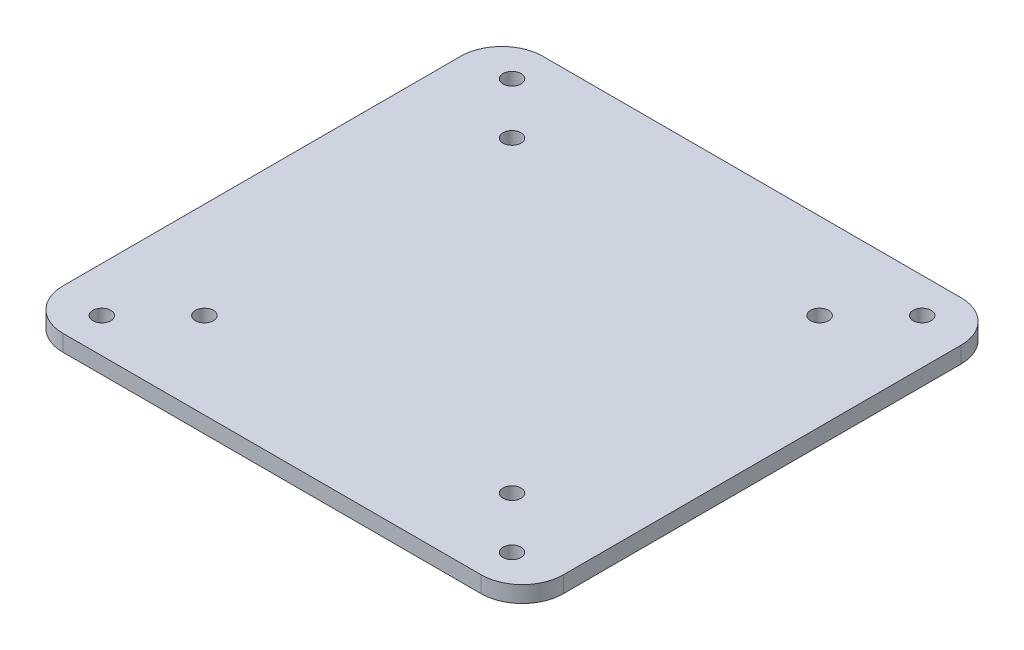
ISO-10303-21;
HEADER;
FILE_DESCRIPTION(('STEP AP214'),'2;1');
FILE_NAME('part.step','',(''),(''),'','','');
FILE_SCHEMA(('AUTOMOTIVE_DESIGN { 1 0 10303 214 1 1 1 1 }'));
ENDSEC;
DATA;
#1=APPLICATION_CONTEXT('core data for automotive mechanical design processes');
#2=APPLICATION_PROTOCOL_DEFINITION('international standard','automotive_design',2000,#1);
#3=PRODUCT_CONTEXT('',#1,'mechanical');
#4=PRODUCT('Part','Part','',(#3));
#5=PRODUCT_RELATED_PRODUCT_CATEGORY('part','',(#4));
#6=PRODUCT_DEFINITION_FORMATION('','',#4);
#7=PRODUCT_DEFINITION_CONTEXT('part definition',#1,'design');
#8=PRODUCT_DEFINITION('design','',#6,#7);
#9=PRODUCT_DEFINITION_SHAPE('','',#8);
#10=(LENGTH_UNIT() NAMED_UNIT(*) SI_UNIT(.MILLI.,.METRE.));
#11=(NAMED_UNIT(*) PLANE_ANGLE_UNIT() SI_UNIT($,.RADIAN.));
#12=(NAMED_UNIT(*) SI_UNIT($,.STERADIAN.) SOLID_ANGLE_UNIT());
#13=UNCERTAINTY_MEASURE_WITH_UNIT(LENGTH_MEASURE(1.E-05),#10,'distance_accuracy_value','');
#14=(GEOMETRIC_REPRESENTATION_CONTEXT(3) GLOBAL_UNCERTAINTY_ASSIGNED_CONTEXT((#13)) GLOBAL_UNIT_ASSIGNED_CONTEXT((#10,
#11,#12)) REPRESENTATION_CONTEXT('',''));
#15=CARTESIAN_POINT('',(0.,0.,0.));
#16=DIRECTION('',(0.,0.,1.));
#17=DIRECTION('',(1.,0.,0.));
#18=AXIS2_PLACEMENT_3D('',#15,#16,#17);
#19=CARTESIAN_POINT('',(0.,4.,0.));
#20=DIRECTION('',(0.,1.,0.));
#21=DIRECTION('',(0.,0.,1.));
#22=AXIS2_PLACEMENT_3D('',#19,#20,#21);
#23=PLANE('',#22);
#24=CARTESIAN_POINT('',(23.5,4.,-21.));
#25=DIRECTION('',(0.,1.,0.));
#26=DIRECTION('',(0.,0.,1.));
#27=AXIS2_PLACEMENT_3D('',#24,#25,#26);
#28=CIRCLE('',#27,2.2);
#29=CARTESIAN_POINT('',(23.5,4.,-18.8));
#30=VERTEX_POINT('',#29);
#31=EDGE_CURVE('E255',#30,#30,#28,.T.);
#32=ORIENTED_EDGE('',*,*,#31,.F.);
#33=EDGE_LOOP('',(#32));
#34=FACE_BOUND('',#33,.T.);
#35=CARTESIAN_POINT('',(98.5,4.,-96.));
#36=DIRECTION('',(0.,1.,0.));
#37=DIRECTION('',(0.,0.,1.));
#38=AXIS2_PLACEMENT_3D('',#35,#36,#37);
#39=CIRCLE('',#38,2.2);
#40=CARTESIAN_POINT('',(98.5,4.,-93.8));
#41=VERTEX_POINT('',#40);
#42=EDGE_CURVE('E239',#41,#41,#39,.T.);
#43=ORIENTED_EDGE('',*,*,#42,.F.);
#44=EDGE_LOOP('',(#43));
#45=FACE_BOUND('',#44,.T.);
#46=CARTESIAN_POINT('',(11.,4.,-8.49999999999999));
#47=DIRECTION('',(0.,1.,0.));
#48=DIRECTION('',(0.,0.,1.));
#49=AXIS2_PLACEMENT_3D('',#46,#47,#48);
#50=CIRCLE('',#49,2.2);
#51=CARTESIAN_POINT('',(11.,4.,-6.3));
#52=VERTEX_POINT('',#51);
#53=EDGE_CURVE('E223',#52,#52,#50,.T.);
#54=ORIENTED_EDGE('',*,*,#53,.F.);
#55=EDGE_LOOP('',(#54));
#56=FACE_BOUND('',#55,.T.);
#57=CARTESIAN_POINT('',(111.,4.,-108.5));
#58=DIRECTION('',(0.,1.,0.));
#59=DIRECTION('',(0.,0.,1.));
#60=AXIS2_PLACEMENT_3D('',#57,#58,#59);
#61=CIRCLE('',#60,2.2);
#62=CARTESIAN_POINT('',(111.,4.,-106.3));
#63=VERTEX_POINT('',#62);
#64=EDGE_CURVE('E141',#63,#63,#61,.T.);
#65=ORIENTED_EDGE('',*,*,#64,.F.);
#66=EDGE_LOOP('',(#65));
#67=FACE_BOUND('',#66,.T.);
#68=DIRECTION('',(-1.,0.,0.));
#69=VECTOR('',#68,1.);
#70=CARTESIAN_POINT('',(0.,4.,-117.));
#71=LINE('',#70,#69);
#72=CARTESIAN_POINT('',(112.,4.,-117.));
#73=VERTEX_POINT('',#72);
#74=CARTESIAN_POINT('',(10.,4.,-117.));
#75=VERTEX_POINT('',#74);
#76=EDGE_CURVE('E152',#73,#75,#71,.T.);
#77=ORIENTED_EDGE('',*,*,#76,.T.);
#78=CARTESIAN_POINT('',(10.,4.,-107.));
#79=DIRECTION('',(0.,1.,0.));
#80=DIRECTION('',(0.,0.,1.));
#81=AXIS2_PLACEMENT_3D('',#78,#79,#80);
#82=CIRCLE('',#81,10.);
#83=CARTESIAN_POINT('',(0.,4.,-107.));
#84=VERTEX_POINT('',#83);
#85=EDGE_CURVE('E182',#75,#84,#82,.T.);
#86=ORIENTED_EDGE('',*,*,#85,.T.);
#87=DIRECTION('',(0.,0.,1.));
#88=VECTOR('',#87,1.);
#89=CARTESIAN_POINT('',(0.,4.,-117.));
#90=LINE('',#89,#88);
#91=CARTESIAN_POINT('',(0.,4.,-10.));
#92=VERTEX_POINT('',#91);
#93=EDGE_CURVE('E131',#84,#92,#90,.T.);
#94=ORIENTED_EDGE('',*,*,#93,.T.);
#95=CARTESIAN_POINT('',(10.,4.,-10.));
#96=DIRECTION('',(0.,1.,0.));
#97=DIRECTION('',(0.,0.,1.));
#98=AXIS2_PLACEMENT_3D('',#95,#96,#97);
#99=CIRCLE('',#98,10.);
#100=CARTESIAN_POINT('',(10.,4.,0.));
#101=VERTEX_POINT('',#100);
#102=EDGE_CURVE('E174',#92,#101,#99,.T.);
#103=ORIENTED_EDGE('',*,*,#102,.T.);
#104=DIRECTION('',(1.,0.,0.));
#105=VECTOR('',#104,1.);
#106=CARTESIAN_POINT('',(0.,4.,0.));
#107=LINE('',#106,#105);
#108=CARTESIAN_POINT('',(112.,4.,0.));
#109=VERTEX_POINT('',#108);
#110=EDGE_CURVE('E197',#101,#109,#107,.T.);
#111=ORIENTED_EDGE('',*,*,#110,.T.);
#112=CARTESIAN_POINT('',(112.,4.,-9.99999999999999));
#113=DIRECTION('',(0.,1.,0.));
#114=DIRECTION('',(0.,0.,1.));
#115=AXIS2_PLACEMENT_3D('',#112,#113,#114);
#116=CIRCLE('',#115,10.);
#117=CARTESIAN_POINT('',(122.,4.,-10.));
#118=VERTEX_POINT('',#117);
#119=EDGE_CURVE('E66',#109,#118,#116,.T.);
#120=ORIENTED_EDGE('',*,*,#119,.T.);
#121=DIRECTION('',(0.,0.,-1.));
#122=VECTOR('',#121,1.);
#123=CARTESIAN_POINT('',(122.,4.,-117.));
#124=LINE('',#123,#122);
#125=CARTESIAN_POINT('',(122.,4.,-107.));
#126=VERTEX_POINT('',#125);
#127=EDGE_CURVE('E205',#118,#126,#124,.T.);
#128=ORIENTED_EDGE('',*,*,#127,.T.);
#129=CARTESIAN_POINT('',(112.,4.,-107.));
#130=DIRECTION('',(0.,1.,0.));
#131=DIRECTION('',(0.,0.,1.));
#132=AXIS2_PLACEMENT_3D('',#129,#130,#131);
#133=CIRCLE('',#132,10.);
#134=EDGE_CURVE('E179',#126,#73,#133,.T.);
#135=ORIENTED_EDGE('',*,*,#134,.T.);
#136=EDGE_LOOP('',(#77,#86,#94,#103,#111,#120,#128,#135));
#137=FACE_BOUND('',#136,.T.);
#138=CARTESIAN_POINT('',(11.,4.,-108.5));
#139=DIRECTION('',(0.,1.,0.));
#140=DIRECTION('',(0.,0.,1.));
#141=AXIS2_PLACEMENT_3D('',#138,#139,#140);
#142=CIRCLE('',#141,2.2);
#143=CARTESIAN_POINT('',(11.,4.,-106.3));
#144=VERTEX_POINT('',#143);
#145=EDGE_CURVE('E217',#144,#144,#142,.T.);
#146=ORIENTED_EDGE('',*,*,#145,.F.);
#147=EDGE_LOOP('',(#146));
#148=FACE_BOUND('',#147,.T.);
#149=CARTESIAN_POINT('',(111.,4.,-8.50000000000001));
#150=DIRECTION('',(0.,1.,0.));
#151=DIRECTION('',(0.,0.,1.));
#152=AXIS2_PLACEMENT_3D('',#149,#150,#151);
#153=CIRCLE('',#152,2.2);
#154=CARTESIAN_POINT('',(111.,4.,-6.30000000000001));
#155=VERTEX_POINT('',#154);
#156=EDGE_CURVE('E231',#155,#155,#153,.T.);
#157=ORIENTED_EDGE('',*,*,#156,.F.);
#158=EDGE_LOOP('',(#157));
#159=FACE_BOUND('',#158,.T.);
#160=CARTESIAN_POINT('',(23.5,4.,-96.));
#161=DIRECTION('',(0.,1.,0.));
#162=DIRECTION('',(0.,0.,1.));
#163=AXIS2_PLACEMENT_3D('',#160,#161,#162);
#164=CIRCLE('',#163,2.2);
#165=CARTESIAN_POINT('',(23.5,4.,-93.8));
#166=VERTEX_POINT('',#165);
#167=EDGE_CURVE('E247',#166,#166,#164,.T.);
#168=ORIENTED_EDGE('',*,*,#167,.F.);
#169=EDGE_LOOP('',(#168));
#170=FACE_BOUND('',#169,.T.);
#171=CARTESIAN_POINT('',(98.5,4.,-21.));
#172=DIRECTION('',(0.,1.,0.));
#173=DIRECTION('',(0.,0.,1.));
#174=AXIS2_PLACEMENT_3D('',#171,#172,#173);
#175=CIRCLE('',#174,2.2);
#176=CARTESIAN_POINT('',(98.5,4.,-18.8));
#177=VERTEX_POINT('',#176);
#178=EDGE_CURVE('E263',#177,#177,#175,.T.);
#179=ORIENTED_EDGE('',*,*,#178,.F.);
#180=EDGE_LOOP('',(#179));
#181=FACE_BOUND('',#180,.T.);
#182=ADVANCED_FACE('F43',(#34,#45,#56,#67,#137,#148,#159,#170,#181),#23,.T.);
#183=CARTESIAN_POINT('',(0.,0.,0.));
#184=DIRECTION('',(0.,1.,0.));
#185=DIRECTION('',(0.,0.,1.));
#186=AXIS2_PLACEMENT_3D('',#183,#184,#185);
#187=PLANE('',#186);
#188=DIRECTION('',(0.,0.,1.));
#189=VECTOR('',#188,1.);
#190=CARTESIAN_POINT('',(0.,0.,-117.));
#191=LINE('',#190,#189);
#192=CARTESIAN_POINT('',(0.,0.,-107.));
#193=VERTEX_POINT('',#192);
#194=CARTESIAN_POINT('',(0.,0.,-10.));
#195=VERTEX_POINT('',#194);
#196=EDGE_CURVE('E128',#193,#195,#191,.T.);
#197=ORIENTED_EDGE('',*,*,#196,.F.);
#198=CARTESIAN_POINT('',(10.,0.,-107.));
#199=DIRECTION('',(0.,1.,0.));
#200=DIRECTION('',(0.,0.,1.));
#201=AXIS2_PLACEMENT_3D('',#198,#199,#200);
#202=CIRCLE('',#201,10.);
#203=CARTESIAN_POINT('',(10.,0.,-117.));
#204=VERTEX_POINT('',#203);
#205=EDGE_CURVE('E110',#193,#204,#202,.F.);
#206=ORIENTED_EDGE('',*,*,#205,.T.);
#207=DIRECTION('',(-1.,0.,0.));
#208=VECTOR('',#207,1.);
#209=CARTESIAN_POINT('',(0.,0.,-117.));
#210=LINE('',#209,#208);
#211=CARTESIAN_POINT('',(112.,0.,-117.));
#212=VERTEX_POINT('',#211);
#213=EDGE_CURVE('E157',#212,#204,#210,.T.);
#214=ORIENTED_EDGE('',*,*,#213,.F.);
#215=CARTESIAN_POINT('',(112.,0.,-107.));
#216=DIRECTION('',(0.,1.,0.));
#217=DIRECTION('',(0.,0.,1.));
#218=AXIS2_PLACEMENT_3D('',#215,#216,#217);
#219=CIRCLE('',#218,10.);
#220=CARTESIAN_POINT('',(122.,0.,-107.));
#221=VERTEX_POINT('',#220);
#222=EDGE_CURVE('E122',#212,#221,#219,.F.);
#223=ORIENTED_EDGE('',*,*,#222,.T.);
#224=DIRECTION('',(0.,0.,-1.));
#225=VECTOR('',#224,1.);
#226=CARTESIAN_POINT('',(122.,0.,-117.));
#227=LINE('',#226,#225);
#228=CARTESIAN_POINT('',(122.,0.,-10.));
#229=VERTEX_POINT('',#228);
#230=EDGE_CURVE('E146',#229,#221,#227,.T.);
#231=ORIENTED_EDGE('',*,*,#230,.F.);
#232=CARTESIAN_POINT('',(112.,0.,-9.99999999999999));
#233=DIRECTION('',(0.,1.,0.));
#234=DIRECTION('',(0.,0.,1.));
#235=AXIS2_PLACEMENT_3D('',#232,#233,#234);
#236=CIRCLE('',#235,10.);
#237=CARTESIAN_POINT('',(112.,0.,0.));
#238=VERTEX_POINT('',#237);
#239=EDGE_CURVE('E164',#229,#238,#236,.F.);
#240=ORIENTED_EDGE('',*,*,#239,.T.);
#241=DIRECTION('',(1.,0.,0.));
#242=VECTOR('',#241,1.);
#243=CARTESIAN_POINT('',(0.,0.,0.));
#244=LINE('',#243,#242);
#245=CARTESIAN_POINT('',(10.,0.,0.));
#246=VERTEX_POINT('',#245);
#247=EDGE_CURVE('E140',#246,#238,#244,.T.);
#248=ORIENTED_EDGE('',*,*,#247,.F.);
#249=CARTESIAN_POINT('',(10.,0.,-10.));
#250=DIRECTION('',(0.,1.,0.));
#251=DIRECTION('',(0.,0.,1.));
#252=AXIS2_PLACEMENT_3D('',#249,#250,#251);
#253=CIRCLE('',#252,10.);
#254=EDGE_CURVE('E133',#246,#195,#253,.F.);
#255=ORIENTED_EDGE('',*,*,#254,.T.);
#256=EDGE_LOOP('',(#197,#206,#214,#223,#231,#240,#248,#255));
#257=FACE_BOUND('',#256,.T.);
#258=CARTESIAN_POINT('',(111.,0.,-108.5));
#259=DIRECTION('',(0.,1.,0.));
#260=DIRECTION('',(0.,0.,1.));
#261=AXIS2_PLACEMENT_3D('',#258,#259,#260);
#262=CIRCLE('',#261,2.2);
#263=CARTESIAN_POINT('',(111.,0.,-106.3));
#264=VERTEX_POINT('',#263);
#265=EDGE_CURVE('E149',#264,#264,#262,.T.);
#266=ORIENTED_EDGE('',*,*,#265,.T.);
#267=EDGE_LOOP('',(#266));
#268=FACE_BOUND('',#267,.T.);
#269=CARTESIAN_POINT('',(11.,0.,-108.5));
#270=DIRECTION('',(0.,1.,0.));
#271=DIRECTION('',(0.,0.,1.));
#272=AXIS2_PLACEMENT_3D('',#269,#270,#271);
#273=CIRCLE('',#272,2.2);
#274=CARTESIAN_POINT('',(11.,0.,-106.3));
#275=VERTEX_POINT('',#274);
#276=EDGE_CURVE('E219',#275,#275,#273,.T.);
#277=ORIENTED_EDGE('',*,*,#276,.T.);
#278=EDGE_LOOP('',(#277));
#279=FACE_BOUND('',#278,.T.);
#280=CARTESIAN_POINT('',(11.,0.,-8.49999999999999));
#281=DIRECTION('',(0.,1.,0.));
#282=DIRECTION('',(0.,0.,1.));
#283=AXIS2_PLACEMENT_3D('',#280,#281,#282);
#284=CIRCLE('',#283,2.2);
#285=CARTESIAN_POINT('',(11.,0.,-6.3));
#286=VERTEX_POINT('',#285);
#287=EDGE_CURVE('E227',#286,#286,#284,.T.);
#288=ORIENTED_EDGE('',*,*,#287,.T.);
#289=EDGE_LOOP('',(#288));
#290=FACE_BOUND('',#289,.T.);
#291=CARTESIAN_POINT('',(111.,0.,-8.50000000000001));
#292=DIRECTION('',(0.,1.,0.));
#293=DIRECTION('',(0.,0.,1.));
#294=AXIS2_PLACEMENT_3D('',#291,#292,#293);
#295=CIRCLE('',#294,2.2);
#296=CARTESIAN_POINT('',(111.,0.,-6.30000000000001));
#297=VERTEX_POINT('',#296);
#298=EDGE_CURVE('E235',#297,#297,#295,.T.);
#299=ORIENTED_EDGE('',*,*,#298,.T.);
#300=EDGE_LOOP('',(#299));
#301=FACE_BOUND('',#300,.T.);
#302=CARTESIAN_POINT('',(98.5,0.,-96.));
#303=DIRECTION('',(0.,1.,0.));
#304=DIRECTION('',(0.,0.,1.));
#305=AXIS2_PLACEMENT_3D('',#302,#303,#304);
#306=CIRCLE('',#305,2.2);
#307=CARTESIAN_POINT('',(98.5,0.,-93.8));
#308=VERTEX_POINT('',#307);
#309=EDGE_CURVE('E243',#308,#308,#306,.T.);
#310=ORIENTED_EDGE('',*,*,#309,.T.);
#311=EDGE_LOOP('',(#310));
#312=FACE_BOUND('',#311,.T.);
#313=CARTESIAN_POINT('',(23.5,0.,-96.));
#314=DIRECTION('',(0.,1.,0.));
#315=DIRECTION('',(0.,0.,1.));
#316=AXIS2_PLACEMENT_3D('',#313,#314,#315);
#317=CIRCLE('',#316,2.2);
#318=CARTESIAN_POINT('',(23.5,0.,-93.8));
#319=VERTEX_POINT('',#318);
#320=EDGE_CURVE('E251',#319,#319,#317,.T.);
#321=ORIENTED_EDGE('',*,*,#320,.T.);
#322=EDGE_LOOP('',(#321));
#323=FACE_BOUND('',#322,.T.);
#324=CARTESIAN_POINT('',(23.5,0.,-21.));
#325=DIRECTION('',(0.,1.,0.));
#326=DIRECTION('',(0.,0.,1.));
#327=AXIS2_PLACEMENT_3D('',#324,#325,#326);
#328=CIRCLE('',#327,2.2);
#329=CARTESIAN_POINT('',(23.5,0.,-18.8));
#330=VERTEX_POINT('',#329);
#331=EDGE_CURVE('E259',#330,#330,#328,.T.);
#332=ORIENTED_EDGE('',*,*,#331,.T.);
#333=EDGE_LOOP('',(#332));
#334=FACE_BOUND('',#333,.T.);
#335=CARTESIAN_POINT('',(98.5,0.,-21.));
#336=DIRECTION('',(0.,1.,0.));
#337=DIRECTION('',(0.,0.,1.));
#338=AXIS2_PLACEMENT_3D('',#335,#336,#337);
#339=CIRCLE('',#338,2.2);
#340=CARTESIAN_POINT('',(98.5,0.,-18.8));
#341=VERTEX_POINT('',#340);
#342=EDGE_CURVE('E267',#341,#341,#339,.T.);
#343=ORIENTED_EDGE('',*,*,#342,.T.);
#344=EDGE_LOOP('',(#343));
#345=FACE_BOUND('',#344,.T.);
#346=ADVANCED_FACE('F136',(#257,#268,#279,#290,#301,#312,#323,#334,#345),#187,.F.);
#347=CARTESIAN_POINT('',(0.,4.,-117.));
#348=DIRECTION('',(1.,0.,0.));
#349=DIRECTION('',(0.,0.,-1.));
#350=AXIS2_PLACEMENT_3D('',#347,#348,#349);
#351=PLANE('',#350);
#352=ORIENTED_EDGE('',*,*,#93,.F.);
#353=DIRECTION('',(0.,-1.,0.));
#354=VECTOR('',#353,1.);
#355=CARTESIAN_POINT('',(0.,4.,-107.));
#356=LINE('',#355,#354);
#357=EDGE_CURVE('E114',#84,#193,#356,.T.);
#358=ORIENTED_EDGE('',*,*,#357,.T.);
#359=ORIENTED_EDGE('',*,*,#196,.T.);
#360=DIRECTION('',(0.,-1.,0.));
#361=VECTOR('',#360,1.);
#362=CARTESIAN_POINT('',(0.,4.,-9.99999999999999));
#363=LINE('',#362,#361);
#364=EDGE_CURVE('E134',#195,#92,#363,.F.);
#365=ORIENTED_EDGE('',*,*,#364,.T.);
#366=EDGE_LOOP('',(#352,#358,#359,#365));
#367=FACE_BOUND('',#366,.T.);
#368=ADVANCED_FACE('F127',(#367),#351,.F.);
#369=CARTESIAN_POINT('',(0.,4.,0.));
#370=DIRECTION('',(0.,0.,-1.));
#371=DIRECTION('',(-1.,0.,0.));
#372=AXIS2_PLACEMENT_3D('',#369,#370,#371);
#373=PLANE('',#372);
#374=ORIENTED_EDGE('',*,*,#247,.T.);
#375=DIRECTION('',(0.,-1.,0.));
#376=VECTOR('',#375,1.);
#377=CARTESIAN_POINT('',(112.,4.,0.));
#378=LINE('',#377,#376);
#379=EDGE_CURVE('E11',#238,#109,#378,.F.);
#380=ORIENTED_EDGE('',*,*,#379,.T.);
#381=ORIENTED_EDGE('',*,*,#110,.F.);
#382=DIRECTION('',(0.,-1.,0.));
#383=VECTOR('',#382,1.);
#384=CARTESIAN_POINT('',(10.,4.,0.));
#385=LINE('',#384,#383);
#386=EDGE_CURVE('E52',#101,#246,#385,.T.);
#387=ORIENTED_EDGE('',*,*,#386,.T.);
#388=EDGE_LOOP('',(#374,#380,#381,#387));
#389=FACE_BOUND('',#388,.T.);
#390=ADVANCED_FACE('F195',(#389),#373,.F.);
#391=CARTESIAN_POINT('',(122.,4.,-117.));
#392=DIRECTION('',(-1.,0.,0.));
#393=DIRECTION('',(0.,0.,1.));
#394=AXIS2_PLACEMENT_3D('',#391,#392,#393);
#395=PLANE('',#394);
#396=ORIENTED_EDGE('',*,*,#230,.T.);
#397=DIRECTION('',(0.,-1.,0.));
#398=VECTOR('',#397,1.);
#399=CARTESIAN_POINT('',(122.,4.,-107.));
#400=LINE('',#399,#398);
#401=EDGE_CURVE('E59',#221,#126,#400,.F.);
#402=ORIENTED_EDGE('',*,*,#401,.T.);
#403=ORIENTED_EDGE('',*,*,#127,.F.);
#404=DIRECTION('',(0.,-1.,0.));
#405=VECTOR('',#404,1.);
#406=CARTESIAN_POINT('',(122.,4.,-9.99999999999999));
#407=LINE('',#406,#405);
#408=EDGE_CURVE('E185',#118,#229,#407,.T.);
#409=ORIENTED_EDGE('',*,*,#408,.T.);
#410=EDGE_LOOP('',(#396,#402,#403,#409));
#411=FACE_BOUND('',#410,.T.);
#412=ADVANCED_FACE('F204',(#411),#395,.F.);
#413=CARTESIAN_POINT('',(0.,4.,-117.));
#414=DIRECTION('',(0.,0.,1.));
#415=DIRECTION('',(1.,0.,0.));
#416=AXIS2_PLACEMENT_3D('',#413,#414,#415);
#417=PLANE('',#416);
#418=ORIENTED_EDGE('',*,*,#213,.T.);
#419=DIRECTION('',(0.,-1.,0.));
#420=VECTOR('',#419,1.);
#421=CARTESIAN_POINT('',(10.,4.,-117.));
#422=LINE('',#421,#420);
#423=EDGE_CURVE('E115',#204,#75,#422,.F.);
#424=ORIENTED_EDGE('',*,*,#423,.T.);
#425=ORIENTED_EDGE('',*,*,#76,.F.);
#426=DIRECTION('',(0.,-1.,0.));
#427=VECTOR('',#426,1.);
#428=CARTESIAN_POINT('',(112.,4.,-117.));
#429=LINE('',#428,#427);
#430=EDGE_CURVE('E121',#73,#212,#429,.T.);
#431=ORIENTED_EDGE('',*,*,#430,.T.);
#432=EDGE_LOOP('',(#418,#424,#425,#431));
#433=FACE_BOUND('',#432,.T.);
#434=ADVANCED_FACE('F291',(#433),#417,.F.);
#435=CARTESIAN_POINT('',(111.,4.,-108.5));
#436=DIRECTION('',(0.,-1.,0.));
#437=DIRECTION('',(0.,0.,-1.));
#438=AXIS2_PLACEMENT_3D('',#435,#436,#437);
#439=CYLINDRICAL_SURFACE('',#438,2.2);
#440=ORIENTED_EDGE('',*,*,#64,.T.);
#441=EDGE_LOOP('',(#440));
#442=FACE_BOUND('',#441,.T.);
#443=ORIENTED_EDGE('',*,*,#265,.F.);
#444=EDGE_LOOP('',(#443));
#445=FACE_BOUND('',#444,.T.);
#446=ADVANCED_FACE('F288',(#442,#445),#439,.F.);
#447=CARTESIAN_POINT('',(11.,4.,-108.5));
#448=DIRECTION('',(0.,-1.,0.));
#449=DIRECTION('',(0.,0.,-1.));
#450=AXIS2_PLACEMENT_3D('',#447,#448,#449);
#451=CYLINDRICAL_SURFACE('',#450,2.2);
#452=ORIENTED_EDGE('',*,*,#145,.T.);
#453=EDGE_LOOP('',(#452));
#454=FACE_BOUND('',#453,.T.);
#455=ORIENTED_EDGE('',*,*,#276,.F.);
#456=EDGE_LOOP('',(#455));
#457=FACE_BOUND('',#456,.T.);
#458=ADVANCED_FACE('F350',(#454,#457),#451,.F.);
#459=CARTESIAN_POINT('',(11.,4.,-8.49999999999999));
#460=DIRECTION('',(0.,-1.,0.));
#461=DIRECTION('',(0.,0.,-1.));
#462=AXIS2_PLACEMENT_3D('',#459,#460,#461);
#463=CYLINDRICAL_SURFACE('',#462,2.2);
#464=ORIENTED_EDGE('',*,*,#53,.T.);
#465=EDGE_LOOP('',(#464));
#466=FACE_BOUND('',#465,.T.);
#467=ORIENTED_EDGE('',*,*,#287,.F.);
#468=EDGE_LOOP('',(#467));
#469=FACE_BOUND('',#468,.T.);
#470=ADVANCED_FACE('F347',(#466,#469),#463,.F.);
#471=CARTESIAN_POINT('',(111.,4.,-8.50000000000001));
#472=DIRECTION('',(0.,-1.,0.));
#473=DIRECTION('',(0.,0.,-1.));
#474=AXIS2_PLACEMENT_3D('',#471,#472,#473);
#475=CYLINDRICAL_SURFACE('',#474,2.2);
#476=ORIENTED_EDGE('',*,*,#156,.T.);
#477=EDGE_LOOP('',(#476));
#478=FACE_BOUND('',#477,.T.);
#479=ORIENTED_EDGE('',*,*,#298,.F.);
#480=EDGE_LOOP('',(#479));
#481=FACE_BOUND('',#480,.T.);
#482=ADVANCED_FACE('F343',(#478,#481),#475,.F.);
#483=CARTESIAN_POINT('',(98.5,4.,-96.));
#484=DIRECTION('',(0.,-1.,0.));
#485=DIRECTION('',(0.,0.,-1.));
#486=AXIS2_PLACEMENT_3D('',#483,#484,#485);
#487=CYLINDRICAL_SURFACE('',#486,2.2);
#488=ORIENTED_EDGE('',*,*,#42,.T.);
#489=EDGE_LOOP('',(#488));
#490=FACE_BOUND('',#489,.T.);
#491=ORIENTED_EDGE('',*,*,#309,.F.);
#492=EDGE_LOOP('',(#491));
#493=FACE_BOUND('',#492,.T.);
#494=ADVANCED_FACE('F325',(#490,#493),#487,.F.);
#495=CARTESIAN_POINT('',(23.5,4.,-96.));
#496=DIRECTION('',(0.,-1.,0.));
#497=DIRECTION('',(0.,0.,-1.));
#498=AXIS2_PLACEMENT_3D('',#495,#496,#497);
#499=CYLINDRICAL_SURFACE('',#498,2.2);
#500=ORIENTED_EDGE('',*,*,#167,.T.);
#501=EDGE_LOOP('',(#500));
#502=FACE_BOUND('',#501,.T.);
#503=ORIENTED_EDGE('',*,*,#320,.F.);
#504=EDGE_LOOP('',(#503));
#505=FACE_BOUND('',#504,.T.);
#506=ADVANCED_FACE('F321',(#502,#505),#499,.F.);
#507=CARTESIAN_POINT('',(23.5,4.,-21.));
#508=DIRECTION('',(0.,-1.,0.));
#509=DIRECTION('',(0.,0.,-1.));
#510=AXIS2_PLACEMENT_3D('',#507,#508,#509);
#511=CYLINDRICAL_SURFACE('',#510,2.2);
#512=ORIENTED_EDGE('',*,*,#31,.T.);
#513=EDGE_LOOP('',(#512));
#514=FACE_BOUND('',#513,.T.);
#515=ORIENTED_EDGE('',*,*,#331,.F.);
#516=EDGE_LOOP('',(#515));
#517=FACE_BOUND('',#516,.T.);
#518=ADVANCED_FACE('F324',(#514,#517),#511,.F.);
#519=CARTESIAN_POINT('',(98.5,4.,-21.));
#520=DIRECTION('',(0.,-1.,0.));
#521=DIRECTION('',(0.,0.,-1.));
#522=AXIS2_PLACEMENT_3D('',#519,#520,#521);
#523=CYLINDRICAL_SURFACE('',#522,2.2);
#524=ORIENTED_EDGE('',*,*,#178,.T.);
#525=EDGE_LOOP('',(#524));
#526=FACE_BOUND('',#525,.T.);
#527=ORIENTED_EDGE('',*,*,#342,.F.);
#528=EDGE_LOOP('',(#527));
#529=FACE_BOUND('',#528,.T.);
#530=ADVANCED_FACE('F275',(#526,#529),#523,.F.);
#531=CARTESIAN_POINT('',(10.,4.,-107.));
#532=DIRECTION('',(0.,-1.,0.));
#533=DIRECTION('',(0.,0.,-1.));
#534=AXIS2_PLACEMENT_3D('',#531,#532,#533);
#535=CYLINDRICAL_SURFACE('',#534,10.);
#536=ORIENTED_EDGE('',*,*,#85,.F.);
#537=ORIENTED_EDGE('',*,*,#423,.F.);
#538=ORIENTED_EDGE('',*,*,#205,.F.);
#539=ORIENTED_EDGE('',*,*,#357,.F.);
#540=EDGE_LOOP('',(#536,#537,#538,#539));
#541=FACE_BOUND('',#540,.T.);
#542=ADVANCED_FACE('F113',(#541),#535,.T.);
#543=CARTESIAN_POINT('',(112.,4.,-107.));
#544=DIRECTION('',(0.,-1.,0.));
#545=DIRECTION('',(0.,0.,-1.));
#546=AXIS2_PLACEMENT_3D('',#543,#544,#545);
#547=CYLINDRICAL_SURFACE('',#546,10.);
#548=ORIENTED_EDGE('',*,*,#134,.F.);
#549=ORIENTED_EDGE('',*,*,#401,.F.);
#550=ORIENTED_EDGE('',*,*,#222,.F.);
#551=ORIENTED_EDGE('',*,*,#430,.F.);
#552=EDGE_LOOP('',(#548,#549,#550,#551));
#553=FACE_BOUND('',#552,.T.);
#554=ADVANCED_FACE('F303',(#553),#547,.T.);
#555=CARTESIAN_POINT('',(112.,4.,-9.99999999999999));
#556=DIRECTION('',(0.,-1.,0.));
#557=DIRECTION('',(0.,0.,-1.));
#558=AXIS2_PLACEMENT_3D('',#555,#556,#557);
#559=CYLINDRICAL_SURFACE('',#558,10.);
#560=ORIENTED_EDGE('',*,*,#119,.F.);
#561=ORIENTED_EDGE('',*,*,#379,.F.);
#562=ORIENTED_EDGE('',*,*,#239,.F.);
#563=ORIENTED_EDGE('',*,*,#408,.F.);
#564=EDGE_LOOP('',(#560,#561,#562,#563));
#565=FACE_BOUND('',#564,.T.);
#566=ADVANCED_FACE('F203',(#565),#559,.T.);
#567=CARTESIAN_POINT('',(10.,4.,-10.));
#568=DIRECTION('',(0.,-1.,0.));
#569=DIRECTION('',(0.,0.,-1.));
#570=AXIS2_PLACEMENT_3D('',#567,#568,#569);
#571=CYLINDRICAL_SURFACE('',#570,10.);
#572=ORIENTED_EDGE('',*,*,#102,.F.);
#573=ORIENTED_EDGE('',*,*,#364,.F.);
#574=ORIENTED_EDGE('',*,*,#254,.F.);
#575=ORIENTED_EDGE('',*,*,#386,.F.);
#576=EDGE_LOOP('',(#572,#573,#574,#575));
#577=FACE_BOUND('',#576,.T.);
#578=ADVANCED_FACE('F45',(#577),#571,.T.);
#579=CLOSED_SHELL('',(#182,#346,#368,#390,#412,#434,#446,#458,#470,#482,#494,#506,#518,#530,
#542,#554,#566,#578));
#580=MANIFOLD_SOLID_BREP('B2',#579);
#581=ADVANCED_BREP_SHAPE_REPRESENTATION('',(#18,#580),#14);
#582=SHAPE_DEFINITION_REPRESENTATION(#9,#581);
ENDSEC;
END-ISO-10303-21;
